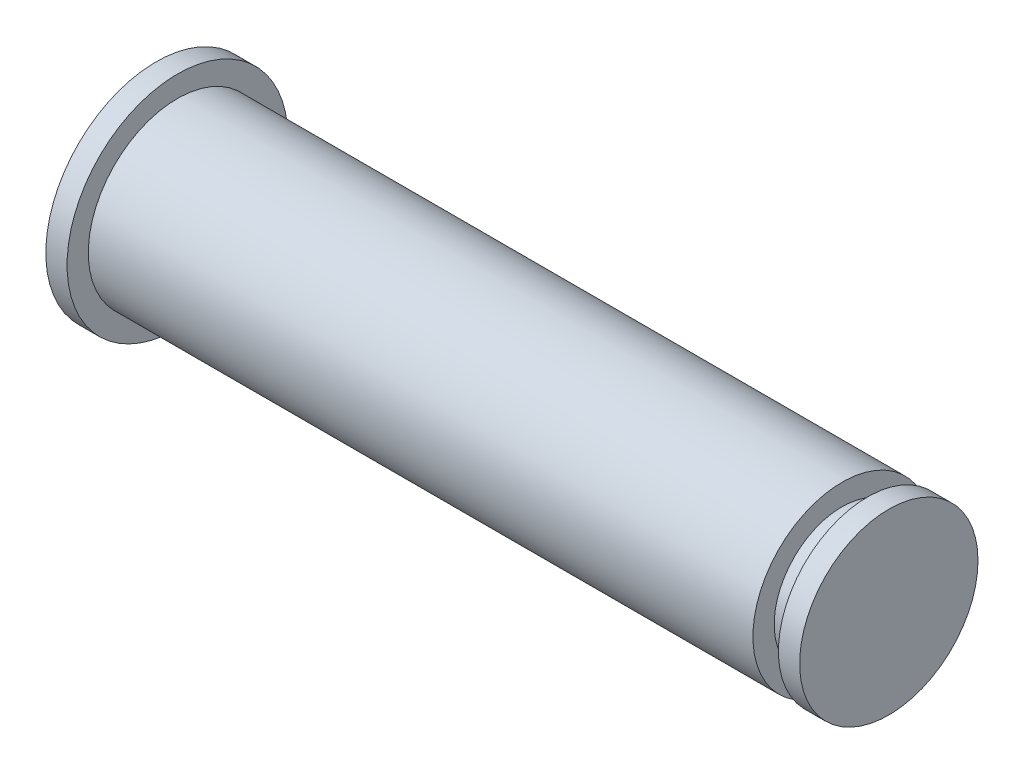
ISO-10303-21;
HEADER;
FILE_DESCRIPTION(('STEP AP214'),'2;1');
FILE_NAME('part.step','',(''),(''),'','','');
FILE_SCHEMA(('AUTOMOTIVE_DESIGN { 1 0 10303 214 1 1 1 1 }'));
ENDSEC;
DATA;
#1=APPLICATION_CONTEXT('core data for automotive mechanical design processes');
#2=APPLICATION_PROTOCOL_DEFINITION('international standard','automotive_design',2000,#1);
#3=PRODUCT_CONTEXT('',#1,'mechanical');
#4=PRODUCT('Part','Part','',(#3));
#5=PRODUCT_RELATED_PRODUCT_CATEGORY('part','',(#4));
#6=PRODUCT_DEFINITION_FORMATION('','',#4);
#7=PRODUCT_DEFINITION_CONTEXT('part definition',#1,'design');
#8=PRODUCT_DEFINITION('design','',#6,#7);
#9=PRODUCT_DEFINITION_SHAPE('','',#8);
#10=(LENGTH_UNIT() NAMED_UNIT(*) SI_UNIT(.MILLI.,.METRE.));
#11=(NAMED_UNIT(*) PLANE_ANGLE_UNIT() SI_UNIT($,.RADIAN.));
#12=(NAMED_UNIT(*) SI_UNIT($,.STERADIAN.) SOLID_ANGLE_UNIT());
#13=UNCERTAINTY_MEASURE_WITH_UNIT(LENGTH_MEASURE(1.E-05),#10,'distance_accuracy_value','');
#14=(GEOMETRIC_REPRESENTATION_CONTEXT(3) GLOBAL_UNCERTAINTY_ASSIGNED_CONTEXT((#13)) GLOBAL_UNIT_ASSIGNED_CONTEXT((#10,
#11,#12)) REPRESENTATION_CONTEXT('',''));
#15=CARTESIAN_POINT('',(0.,0.,0.));
#16=DIRECTION('',(0.,0.,1.));
#17=DIRECTION('',(1.,0.,0.));
#18=AXIS2_PLACEMENT_3D('',#15,#16,#17);
#19=CARTESIAN_POINT('',(0.,0.,0.));
#20=DIRECTION('',(1.,0.,0.));
#21=DIRECTION('',(0.,0.,1.));
#22=AXIS2_PLACEMENT_3D('',#19,#20,#21);
#23=PLANE('',#22);
#24=CARTESIAN_POINT('',(0.,0.,0.));
#25=DIRECTION('',(1.,0.,0.));
#26=DIRECTION('',(0.,0.,-1.));
#27=AXIS2_PLACEMENT_3D('',#24,#25,#26);
#28=CIRCLE('',#27,5.2);
#29=CARTESIAN_POINT('',(0.,0.,-5.2));
#30=VERTEX_POINT('',#29);
#31=EDGE_CURVE('E10',#30,#30,#28,.T.);
#32=ORIENTED_EDGE('',*,*,#31,.F.);
#33=EDGE_LOOP('',(#32));
#34=FACE_BOUND('',#33,.T.);
#35=ADVANCED_FACE('F31',(#34),#23,.F.);
#36=CARTESIAN_POINT('',(0.,0.,0.));
#37=DIRECTION('',(-1.,0.,0.));
#38=DIRECTION('',(0.,0.,-1.));
#39=AXIS2_PLACEMENT_3D('',#36,#37,#38);
#40=CYLINDRICAL_SURFACE('',#39,5.2);
#41=ORIENTED_EDGE('',*,*,#31,.T.);
#42=EDGE_LOOP('',(#41));
#43=FACE_BOUND('',#42,.T.);
#44=CARTESIAN_POINT('',(1.,0.,0.));
#45=DIRECTION('',(1.,0.,0.));
#46=DIRECTION('',(0.,0.,-1.));
#47=AXIS2_PLACEMENT_3D('',#44,#45,#46);
#48=CIRCLE('',#47,5.2);
#49=CARTESIAN_POINT('',(1.,0.,-5.2));
#50=VERTEX_POINT('',#49);
#51=EDGE_CURVE('E37',#50,#50,#48,.T.);
#52=ORIENTED_EDGE('',*,*,#51,.F.);
#53=EDGE_LOOP('',(#52));
#54=FACE_BOUND('',#53,.T.);
#55=ADVANCED_FACE('F79',(#43,#54),#40,.T.);
#56=CARTESIAN_POINT('',(1.,5.19999999999998,0.));
#57=DIRECTION('',(-1.,0.,0.));
#58=DIRECTION('',(0.,0.,-1.));
#59=AXIS2_PLACEMENT_3D('',#56,#57,#58);
#60=PLANE('',#59);
#61=ORIENTED_EDGE('',*,*,#51,.T.);
#62=EDGE_LOOP('',(#61));
#63=FACE_BOUND('',#62,.T.);
#64=CARTESIAN_POINT('',(1.,0.,0.));
#65=DIRECTION('',(1.,0.,0.));
#66=DIRECTION('',(0.,0.,-1.));
#67=AXIS2_PLACEMENT_3D('',#64,#65,#66);
#68=CIRCLE('',#67,4.2);
#69=CARTESIAN_POINT('',(1.,0.,-4.2));
#70=VERTEX_POINT('',#69);
#71=EDGE_CURVE('E41',#70,#70,#68,.T.);
#72=ORIENTED_EDGE('',*,*,#71,.F.);
#73=EDGE_LOOP('',(#72));
#74=FACE_BOUND('',#73,.T.);
#75=ADVANCED_FACE('F84',(#63,#74),#60,.F.);
#76=CARTESIAN_POINT('',(0.,0.,0.));
#77=DIRECTION('',(-1.,0.,0.));
#78=DIRECTION('',(0.,0.,-1.));
#79=AXIS2_PLACEMENT_3D('',#76,#77,#78);
#80=CYLINDRICAL_SURFACE('',#79,4.2);
#81=ORIENTED_EDGE('',*,*,#71,.T.);
#82=EDGE_LOOP('',(#81));
#83=FACE_BOUND('',#82,.T.);
#84=CARTESIAN_POINT('',(32.3,0.,0.));
#85=DIRECTION('',(1.,0.,0.));
#86=DIRECTION('',(0.,0.,-1.));
#87=AXIS2_PLACEMENT_3D('',#84,#85,#86);
#88=CIRCLE('',#87,4.2);
#89=CARTESIAN_POINT('',(32.3,0.,-4.20000000000001));
#90=VERTEX_POINT('',#89);
#91=EDGE_CURVE('E45',#90,#90,#88,.T.);
#92=ORIENTED_EDGE('',*,*,#91,.F.);
#93=EDGE_LOOP('',(#92));
#94=FACE_BOUND('',#93,.T.);
#95=ADVANCED_FACE('F88',(#83,#94),#80,.T.);
#96=CARTESIAN_POINT('',(32.3,4.19999999999998,0.));
#97=DIRECTION('',(-1.,0.,0.));
#98=DIRECTION('',(0.,0.,-1.));
#99=AXIS2_PLACEMENT_3D('',#96,#97,#98);
#100=PLANE('',#99);
#101=ORIENTED_EDGE('',*,*,#91,.T.);
#102=EDGE_LOOP('',(#101));
#103=FACE_BOUND('',#102,.T.);
#104=CARTESIAN_POINT('',(32.3,0.,0.));
#105=DIRECTION('',(1.,0.,0.));
#106=DIRECTION('',(0.,0.,-1.));
#107=AXIS2_PLACEMENT_3D('',#104,#105,#106);
#108=CIRCLE('',#107,3.2);
#109=CARTESIAN_POINT('',(32.3,0.,-3.20000000000001));
#110=VERTEX_POINT('',#109);
#111=EDGE_CURVE('E50',#110,#110,#108,.T.);
#112=ORIENTED_EDGE('',*,*,#111,.F.);
#113=EDGE_LOOP('',(#112));
#114=FACE_BOUND('',#113,.T.);
#115=ADVANCED_FACE('F94',(#103,#114),#100,.F.);
#116=CARTESIAN_POINT('',(0.,0.,0.));
#117=DIRECTION('',(-1.,0.,0.));
#118=DIRECTION('',(0.,0.,-1.));
#119=AXIS2_PLACEMENT_3D('',#116,#117,#118);
#120=CYLINDRICAL_SURFACE('',#119,3.2);
#121=ORIENTED_EDGE('',*,*,#111,.T.);
#122=EDGE_LOOP('',(#121));
#123=FACE_BOUND('',#122,.T.);
#124=CARTESIAN_POINT('',(33.5,0.,0.));
#125=DIRECTION('',(1.,0.,0.));
#126=DIRECTION('',(0.,0.,-1.));
#127=AXIS2_PLACEMENT_3D('',#124,#125,#126);
#128=CIRCLE('',#127,3.2);
#129=CARTESIAN_POINT('',(33.5,0.,-3.2));
#130=VERTEX_POINT('',#129);
#131=EDGE_CURVE('E53',#130,#130,#128,.T.);
#132=ORIENTED_EDGE('',*,*,#131,.F.);
#133=EDGE_LOOP('',(#132));
#134=FACE_BOUND('',#133,.T.);
#135=ADVANCED_FACE('F75',(#123,#134),#120,.T.);
#136=CARTESIAN_POINT('',(33.5,4.19999999999998,0.));
#137=DIRECTION('',(1.,0.,0.));
#138=DIRECTION('',(0.,0.,1.));
#139=AXIS2_PLACEMENT_3D('',#136,#137,#138);
#140=PLANE('',#139);
#141=ORIENTED_EDGE('',*,*,#131,.T.);
#142=EDGE_LOOP('',(#141));
#143=FACE_BOUND('',#142,.T.);
#144=CARTESIAN_POINT('',(33.5,0.,0.));
#145=DIRECTION('',(1.,0.,0.));
#146=DIRECTION('',(0.,0.,-1.));
#147=AXIS2_PLACEMENT_3D('',#144,#145,#146);
#148=CIRCLE('',#147,4.2);
#149=CARTESIAN_POINT('',(33.5,0.,-4.2));
#150=VERTEX_POINT('',#149);
#151=EDGE_CURVE('E56',#150,#150,#148,.T.);
#152=ORIENTED_EDGE('',*,*,#151,.F.);
#153=EDGE_LOOP('',(#152));
#154=FACE_BOUND('',#153,.T.);
#155=ADVANCED_FACE('F67',(#143,#154),#140,.F.);
#156=CARTESIAN_POINT('',(0.,0.,0.));
#157=DIRECTION('',(-1.,0.,0.));
#158=DIRECTION('',(0.,0.,-1.));
#159=AXIS2_PLACEMENT_3D('',#156,#157,#158);
#160=CYLINDRICAL_SURFACE('',#159,4.2);
#161=ORIENTED_EDGE('',*,*,#151,.T.);
#162=EDGE_LOOP('',(#161));
#163=FACE_BOUND('',#162,.T.);
#164=CARTESIAN_POINT('',(34.5,0.,0.));
#165=DIRECTION('',(1.,0.,0.));
#166=DIRECTION('',(0.,0.,-1.));
#167=AXIS2_PLACEMENT_3D('',#164,#165,#166);
#168=CIRCLE('',#167,4.2);
#169=CARTESIAN_POINT('',(34.5,0.,-4.20000000000001));
#170=VERTEX_POINT('',#169);
#171=EDGE_CURVE('E59',#170,#170,#168,.T.);
#172=ORIENTED_EDGE('',*,*,#171,.F.);
#173=EDGE_LOOP('',(#172));
#174=FACE_BOUND('',#173,.T.);
#175=ADVANCED_FACE('F65',(#163,#174),#160,.T.);
#176=CARTESIAN_POINT('',(34.5,0.,0.));
#177=DIRECTION('',(-1.,0.,0.));
#178=DIRECTION('',(0.,0.,-1.));
#179=AXIS2_PLACEMENT_3D('',#176,#177,#178);
#180=PLANE('',#179);
#181=ORIENTED_EDGE('',*,*,#171,.T.);
#182=EDGE_LOOP('',(#181));
#183=FACE_BOUND('',#182,.T.);
#184=ADVANCED_FACE('F63',(#183),#180,.F.);
#185=CLOSED_SHELL('',(#35,#55,#75,#95,#115,#135,#155,#175,#184));
#186=MANIFOLD_SOLID_BREP('B2',#185);
#187=ADVANCED_BREP_SHAPE_REPRESENTATION('',(#18,#186),#14);
#188=SHAPE_DEFINITION_REPRESENTATION(#9,#187);
ENDSEC;
END-ISO-10303-21;
